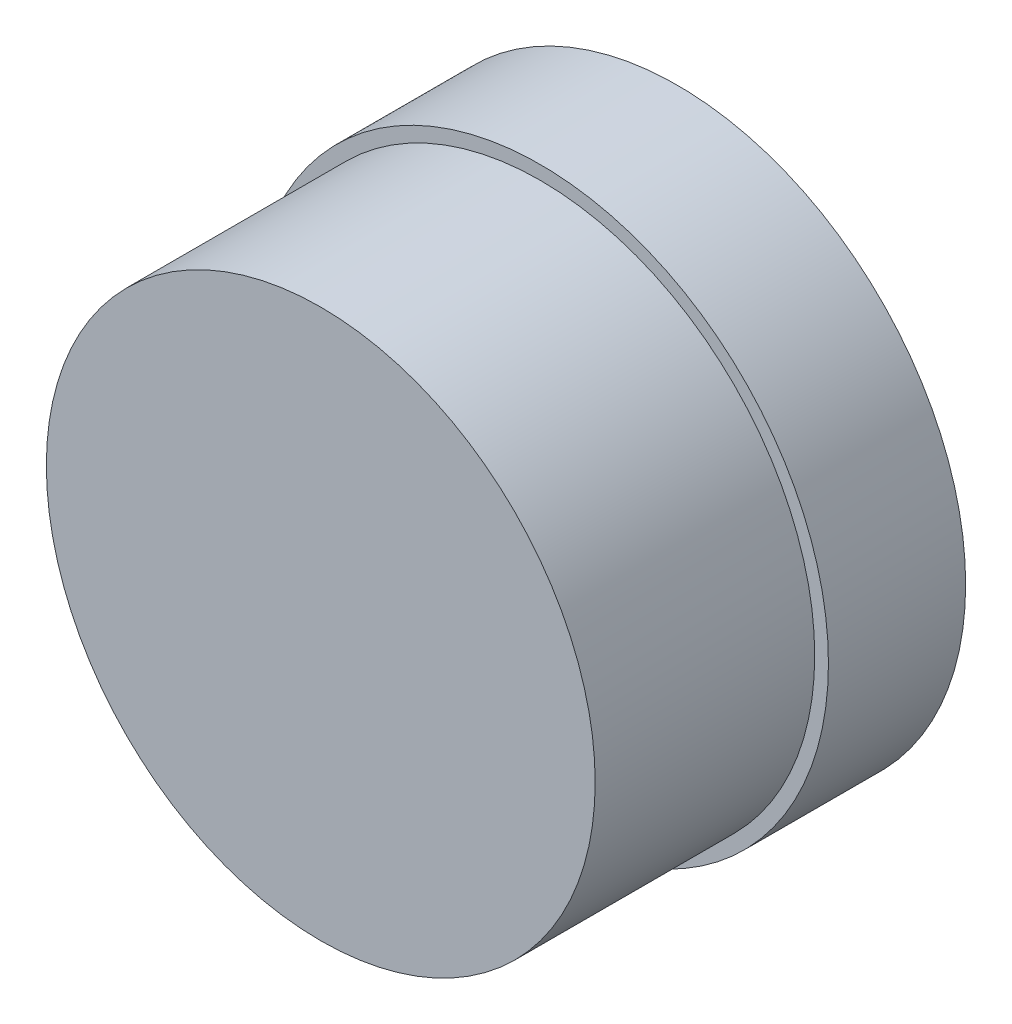
ISO-10303-21;
HEADER;
FILE_DESCRIPTION(('STEP AP214'),'2;1');
FILE_NAME('part.step','',(''),(''),'','','');
FILE_SCHEMA(('AUTOMOTIVE_DESIGN { 1 0 10303 214 1 1 1 1 }'));
ENDSEC;
DATA;
#1=APPLICATION_CONTEXT('core data for automotive mechanical design processes');
#2=APPLICATION_PROTOCOL_DEFINITION('international standard','automotive_design',2000,#1);
#3=PRODUCT_CONTEXT('',#1,'mechanical');
#4=PRODUCT('Part','Part','',(#3));
#5=PRODUCT_RELATED_PRODUCT_CATEGORY('part','',(#4));
#6=PRODUCT_DEFINITION_FORMATION('','',#4);
#7=PRODUCT_DEFINITION_CONTEXT('part definition',#1,'design');
#8=PRODUCT_DEFINITION('design','',#6,#7);
#9=PRODUCT_DEFINITION_SHAPE('','',#8);
#10=(LENGTH_UNIT() NAMED_UNIT(*) SI_UNIT(.MILLI.,.METRE.));
#11=(NAMED_UNIT(*) PLANE_ANGLE_UNIT() SI_UNIT($,.RADIAN.));
#12=(NAMED_UNIT(*) SI_UNIT($,.STERADIAN.) SOLID_ANGLE_UNIT());
#13=UNCERTAINTY_MEASURE_WITH_UNIT(LENGTH_MEASURE(1.E-05),#10,'distance_accuracy_value','');
#14=(GEOMETRIC_REPRESENTATION_CONTEXT(3) GLOBAL_UNCERTAINTY_ASSIGNED_CONTEXT((#13)) GLOBAL_UNIT_ASSIGNED_CONTEXT((#10,
#11,#12)) REPRESENTATION_CONTEXT('',''));
#15=CARTESIAN_POINT('',(0.,0.,0.));
#16=DIRECTION('',(0.,0.,1.));
#17=DIRECTION('',(1.,0.,0.));
#18=AXIS2_PLACEMENT_3D('',#15,#16,#17);
#19=CARTESIAN_POINT('',(0.,0.,5.));
#20=DIRECTION('',(0.,0.,-1.));
#21=DIRECTION('',(-1.,0.,0.));
#22=AXIS2_PLACEMENT_3D('',#19,#20,#21);
#23=CYLINDRICAL_SURFACE('',#22,10.5);
#24=CARTESIAN_POINT('',(0.,0.,5.));
#25=DIRECTION('',(0.,0.,1.));
#26=DIRECTION('',(1.,0.,0.));
#27=AXIS2_PLACEMENT_3D('',#24,#25,#26);
#28=CIRCLE('',#27,10.5);
#29=CARTESIAN_POINT('',(10.5,0.,5.));
#30=VERTEX_POINT('',#29);
#31=EDGE_CURVE('E40',#30,#30,#28,.T.);
#32=ORIENTED_EDGE('',*,*,#31,.F.);
#33=EDGE_LOOP('',(#32));
#34=FACE_BOUND('',#33,.T.);
#35=CARTESIAN_POINT('',(0.,0.,0.));
#36=DIRECTION('',(0.,0.,1.));
#37=DIRECTION('',(1.,0.,0.));
#38=AXIS2_PLACEMENT_3D('',#35,#36,#37);
#39=CIRCLE('',#38,10.5);
#40=CARTESIAN_POINT('',(10.5,0.,0.));
#41=VERTEX_POINT('',#40);
#42=EDGE_CURVE('E36',#41,#41,#39,.T.);
#43=ORIENTED_EDGE('',*,*,#42,.T.);
#44=EDGE_LOOP('',(#43));
#45=FACE_BOUND('',#44,.T.);
#46=ADVANCED_FACE('F33',(#34,#45),#23,.T.);
#47=CARTESIAN_POINT('',(0.,0.,5.));
#48=DIRECTION('',(0.,0.,1.));
#49=DIRECTION('',(1.,0.,0.));
#50=AXIS2_PLACEMENT_3D('',#47,#48,#49);
#51=PLANE('',#50);
#52=CARTESIAN_POINT('',(0.,0.,5.));
#53=DIRECTION('',(0.,0.,1.));
#54=DIRECTION('',(1.,0.,0.));
#55=AXIS2_PLACEMENT_3D('',#52,#53,#54);
#56=CIRCLE('',#55,10.);
#57=CARTESIAN_POINT('',(10.,0.,5.));
#58=VERTEX_POINT('',#57);
#59=EDGE_CURVE('E10',#58,#58,#56,.T.);
#60=ORIENTED_EDGE('',*,*,#59,.F.);
#61=EDGE_LOOP('',(#60));
#62=FACE_BOUND('',#61,.T.);
#63=ORIENTED_EDGE('',*,*,#31,.T.);
#64=EDGE_LOOP('',(#63));
#65=FACE_BOUND('',#64,.T.);
#66=ADVANCED_FACE('F57',(#62,#65),#51,.T.);
#67=CARTESIAN_POINT('',(0.,0.,0.));
#68=DIRECTION('',(0.,0.,1.));
#69=DIRECTION('',(1.,0.,0.));
#70=AXIS2_PLACEMENT_3D('',#67,#68,#69);
#71=PLANE('',#70);
#72=ORIENTED_EDGE('',*,*,#42,.F.);
#73=EDGE_LOOP('',(#72));
#74=FACE_BOUND('',#73,.T.);
#75=ADVANCED_FACE('F54',(#74),#71,.F.);
#76=CARTESIAN_POINT('',(0.,0.,13.));
#77=DIRECTION('',(0.,0.,-1.));
#78=DIRECTION('',(-1.,0.,0.));
#79=AXIS2_PLACEMENT_3D('',#76,#77,#78);
#80=CYLINDRICAL_SURFACE('',#79,10.);
#81=CARTESIAN_POINT('',(0.,0.,13.));
#82=DIRECTION('',(0.,0.,1.));
#83=DIRECTION('',(1.,0.,0.));
#84=AXIS2_PLACEMENT_3D('',#81,#82,#83);
#85=CIRCLE('',#84,10.);
#86=CARTESIAN_POINT('',(10.,0.,13.));
#87=VERTEX_POINT('',#86);
#88=EDGE_CURVE('E46',#87,#87,#85,.T.);
#89=ORIENTED_EDGE('',*,*,#88,.F.);
#90=EDGE_LOOP('',(#89));
#91=FACE_BOUND('',#90,.T.);
#92=ORIENTED_EDGE('',*,*,#59,.T.);
#93=EDGE_LOOP('',(#92));
#94=FACE_BOUND('',#93,.T.);
#95=ADVANCED_FACE('F56',(#91,#94),#80,.T.);
#96=CARTESIAN_POINT('',(0.,0.,13.));
#97=DIRECTION('',(0.,0.,1.));
#98=DIRECTION('',(1.,0.,0.));
#99=AXIS2_PLACEMENT_3D('',#96,#97,#98);
#100=PLANE('',#99);
#101=ORIENTED_EDGE('',*,*,#88,.T.);
#102=EDGE_LOOP('',(#101));
#103=FACE_BOUND('',#102,.T.);
#104=ADVANCED_FACE('F62',(#103),#100,.T.);
#105=CLOSED_SHELL('',(#46,#66,#75,#95,#104));
#106=MANIFOLD_SOLID_BREP('B2',#105);
#107=ADVANCED_BREP_SHAPE_REPRESENTATION('',(#18,#106),#14);
#108=SHAPE_DEFINITION_REPRESENTATION(#9,#107);
ENDSEC;
END-ISO-10303-21;
